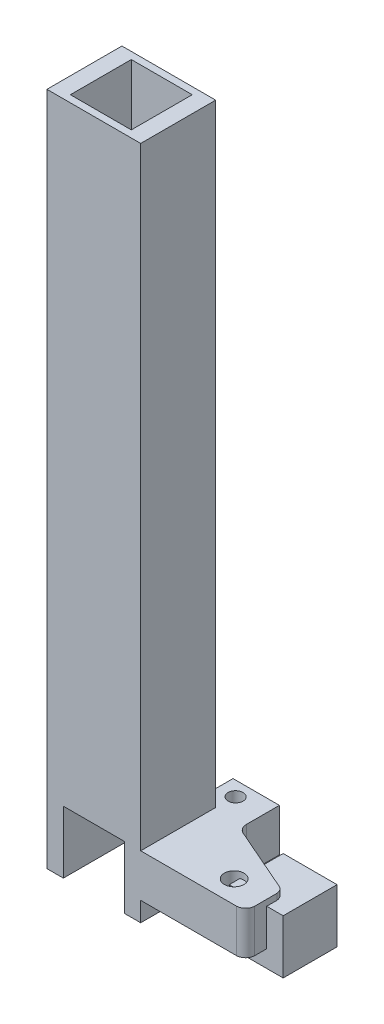
ISO-10303-21;
HEADER;
FILE_DESCRIPTION(('STEP AP214'),'2;1');
FILE_NAME('part.step','',(''),(''),'','','');
FILE_SCHEMA(('AUTOMOTIVE_DESIGN { 1 0 10303 214 1 1 1 1 }'));
ENDSEC;
DATA;
#1=APPLICATION_CONTEXT('core data for automotive mechanical design processes');
#2=APPLICATION_PROTOCOL_DEFINITION('international standard','automotive_design',2000,#1);
#3=PRODUCT_CONTEXT('',#1,'mechanical');
#4=PRODUCT('Part','Part','',(#3));
#5=PRODUCT_RELATED_PRODUCT_CATEGORY('part','',(#4));
#6=PRODUCT_DEFINITION_FORMATION('','',#4);
#7=PRODUCT_DEFINITION_CONTEXT('part definition',#1,'design');
#8=PRODUCT_DEFINITION('design','',#6,#7);
#9=PRODUCT_DEFINITION_SHAPE('','',#8);
#10=(LENGTH_UNIT() NAMED_UNIT(*) SI_UNIT(.MILLI.,.METRE.));
#11=(NAMED_UNIT(*) PLANE_ANGLE_UNIT() SI_UNIT($,.RADIAN.));
#12=(NAMED_UNIT(*) SI_UNIT($,.STERADIAN.) SOLID_ANGLE_UNIT());
#13=UNCERTAINTY_MEASURE_WITH_UNIT(LENGTH_MEASURE(1.E-05),#10,'distance_accuracy_value','');
#14=(GEOMETRIC_REPRESENTATION_CONTEXT(3) GLOBAL_UNCERTAINTY_ASSIGNED_CONTEXT((#13)) GLOBAL_UNIT_ASSIGNED_CONTEXT((#10,
#11,#12)) REPRESENTATION_CONTEXT('',''));
#15=CARTESIAN_POINT('',(0.,0.,0.));
#16=DIRECTION('',(0.,0.,1.));
#17=DIRECTION('',(1.,0.,0.));
#18=AXIS2_PLACEMENT_3D('',#15,#16,#17);
#19=CARTESIAN_POINT('',(-22.1081588772787,1.3,16.));
#20=DIRECTION('',(0.,-1.,0.));
#21=DIRECTION('',(0.,0.,-1.));
#22=AXIS2_PLACEMENT_3D('',#19,#20,#21);
#23=PLANE('',#22);
#24=CARTESIAN_POINT('',(-10.7531974056641,1.3,11.199999999995));
#25=DIRECTION('',(0.,1.,0.));
#26=DIRECTION('',(0.,0.,1.));
#27=AXIS2_PLACEMENT_3D('',#24,#25,#26);
#28=CIRCLE('',#27,2.1);
#29=CARTESIAN_POINT('',(-10.7531974056641,1.3,13.299999999995));
#30=VERTEX_POINT('',#29);
#31=EDGE_CURVE('E231',#30,#30,#28,.T.);
#32=ORIENTED_EDGE('',*,*,#31,.F.);
#33=EDGE_LOOP('',(#32));
#34=FACE_BOUND('',#33,.T.);
#35=CARTESIAN_POINT('',(-25.7531588772787,1.3,-4.1));
#36=DIRECTION('',(0.,1.,0.));
#37=DIRECTION('',(0.,0.,1.));
#38=AXIS2_PLACEMENT_3D('',#35,#36,#37);
#39=CIRCLE('',#38,1.6);
#40=CARTESIAN_POINT('',(-25.7531588772787,1.3,-2.5));
#41=VERTEX_POINT('',#40);
#42=EDGE_CURVE('E282',#41,#41,#39,.T.);
#43=ORIENTED_EDGE('',*,*,#42,.F.);
#44=EDGE_LOOP('',(#43));
#45=FACE_BOUND('',#44,.T.);
#46=CARTESIAN_POINT('',(-5.35319740566404,1.3,9.45803114956662));
#47=DIRECTION('',(0.,1.,0.));
#48=DIRECTION('',(0.,0.,1.));
#49=AXIS2_PLACEMENT_3D('',#46,#47,#48);
#50=CIRCLE('',#49,1.85);
#51=CARTESIAN_POINT('',(-3.50815887727866,1.3,9.32263237271288));
#52=VERTEX_POINT('',#51);
#53=CARTESIAN_POINT('',(-4.61168256272759,1.3,7.76314007999756));
#54=VERTEX_POINT('',#53);
#55=EDGE_CURVE('E63',#52,#54,#50,.T.);
#56=ORIENTED_EDGE('',*,*,#55,.T.);
#57=DIRECTION('',(-0.91615733490219,0.,-0.400818834019706));
#58=VECTOR('',#57,1.);
#59=CARTESIAN_POINT('',(-3.59162011322418,1.3,8.2094174016553));
#60=LINE('',#59,#58);
#61=CARTESIAN_POINT('',(-18.2149578988064,1.3,1.81170712046311));
#62=VERTEX_POINT('',#61);
#63=EDGE_CURVE('E243',#54,#62,#60,.T.);
#64=ORIENTED_EDGE('',*,*,#63,.T.);
#65=CARTESIAN_POINT('',(-17.353197405664,1.3,-0.158031149576604));
#66=DIRECTION('',(0.,1.,0.));
#67=DIRECTION('',(0.,0.,1.));
#68=AXIS2_PLACEMENT_3D('',#65,#66,#67);
#69=CIRCLE('',#68,2.15);
#70=CARTESIAN_POINT('',(-19.503197405664,1.3,-0.158031149576604));
#71=VERTEX_POINT('',#70);
#72=EDGE_CURVE('E240',#71,#62,#69,.T.);
#73=ORIENTED_EDGE('',*,*,#72,.F.);
#74=DIRECTION('',(0.,0.,-1.));
#75=VECTOR('',#74,1.);
#76=CARTESIAN_POINT('',(-19.503197405664,1.3,0.));
#77=LINE('',#76,#75);
#78=CARTESIAN_POINT('',(-19.503197405664,1.3,-7.2));
#79=VERTEX_POINT('',#78);
#80=EDGE_CURVE('E237',#71,#79,#77,.T.);
#81=ORIENTED_EDGE('',*,*,#80,.T.);
#82=DIRECTION('',(1.,0.,0.));
#83=VECTOR('',#82,1.);
#84=CARTESIAN_POINT('',(-29.3981588772787,1.3,-7.2));
#85=LINE('',#84,#83);
#86=CARTESIAN_POINT('',(-29.3981588772787,1.3,-7.2));
#87=VERTEX_POINT('',#86);
#88=EDGE_CURVE('E229',#87,#79,#85,.T.);
#89=ORIENTED_EDGE('',*,*,#88,.F.);
#90=DIRECTION('',(0.,0.,1.));
#91=VECTOR('',#90,1.);
#92=CARTESIAN_POINT('',(-29.3981588772787,1.3,-7.2));
#93=LINE('',#92,#91);
#94=CARTESIAN_POINT('',(-29.3981588772787,1.3,0.));
#95=VERTEX_POINT('',#94);
#96=EDGE_CURVE('E291',#87,#95,#93,.T.);
#97=ORIENTED_EDGE('',*,*,#96,.T.);
#98=DIRECTION('',(1.,0.,0.));
#99=VECTOR('',#98,1.);
#100=CARTESIAN_POINT('',(-29.3981588772787,1.3,0.));
#101=LINE('',#100,#99);
#102=CARTESIAN_POINT('',(-25.8981588772787,1.3,0.));
#103=VERTEX_POINT('',#102);
#104=EDGE_CURVE('E287',#95,#103,#101,.T.);
#105=ORIENTED_EDGE('',*,*,#104,.T.);
#106=DIRECTION('',(0.,0.,1.));
#107=VECTOR('',#106,1.);
#108=CARTESIAN_POINT('',(-25.8981588772787,1.3,16.));
#109=LINE('',#108,#107);
#110=CARTESIAN_POINT('',(-25.8981588772787,1.3,16.));
#111=VERTEX_POINT('',#110);
#112=EDGE_CURVE('E299',#103,#111,#109,.T.);
#113=ORIENTED_EDGE('',*,*,#112,.T.);
#114=DIRECTION('',(-1.,0.,0.));
#115=VECTOR('',#114,1.);
#116=CARTESIAN_POINT('',(-22.1081588772787,1.3,16.));
#117=LINE('',#116,#115);
#118=CARTESIAN_POINT('',(-5.50319740566405,1.3,16.));
#119=VERTEX_POINT('',#118);
#120=EDGE_CURVE('E302',#119,#111,#117,.T.);
#121=ORIENTED_EDGE('',*,*,#120,.F.);
#122=CARTESIAN_POINT('',(-5.50319740566405,1.3,13.999999999995));
#123=DIRECTION('',(0.,1.,0.));
#124=DIRECTION('',(0.,0.,1.));
#125=AXIS2_PLACEMENT_3D('',#122,#123,#124);
#126=CIRCLE('',#125,2.00000000000004);
#127=CARTESIAN_POINT('',(-3.50815887727866,1.3,14.1407880330732));
#128=VERTEX_POINT('',#127);
#129=EDGE_CURVE('E251',#119,#128,#126,.T.);
#130=ORIENTED_EDGE('',*,*,#129,.T.);
#131=DIRECTION('',(0.,0.,1.));
#132=VECTOR('',#131,1.);
#133=CARTESIAN_POINT('',(-3.50815887727866,1.3,16.));
#134=LINE('',#133,#132);
#135=EDGE_CURVE('E260',#52,#128,#134,.T.);
#136=ORIENTED_EDGE('',*,*,#135,.F.);
#137=EDGE_LOOP('',(#56,#64,#73,#81,#89,#97,#105,#113,#121,#130,#136));
#138=FACE_BOUND('',#137,.T.);
#139=ADVANCED_FACE('F47',(#34,#45,#138),#23,.F.);
#140=CARTESIAN_POINT('',(-22.1081588772787,-7.85,0.));
#141=DIRECTION('',(0.,1.,0.));
#142=DIRECTION('',(0.,0.,1.));
#143=AXIS2_PLACEMENT_3D('',#140,#141,#142);
#144=PLANE('',#143);
#145=CARTESIAN_POINT('',(-10.7531974056641,-7.85,11.199999999995));
#146=DIRECTION('',(0.,1.,0.));
#147=DIRECTION('',(0.,0.,1.));
#148=AXIS2_PLACEMENT_3D('',#145,#146,#147);
#149=CIRCLE('',#148,2.1);
#150=CARTESIAN_POINT('',(-10.7531974056641,-7.85,13.299999999995));
#151=VERTEX_POINT('',#150);
#152=EDGE_CURVE('E51',#151,#151,#149,.T.);
#153=ORIENTED_EDGE('',*,*,#152,.T.);
#154=EDGE_LOOP('',(#153));
#155=FACE_BOUND('',#154,.T.);
#156=CARTESIAN_POINT('',(-25.7531588772787,-7.85,-4.1));
#157=DIRECTION('',(0.,1.,0.));
#158=DIRECTION('',(0.,0.,1.));
#159=AXIS2_PLACEMENT_3D('',#156,#157,#158);
#160=CIRCLE('',#159,1.6);
#161=CARTESIAN_POINT('',(-25.7531588772787,-7.85,-2.5));
#162=VERTEX_POINT('',#161);
#163=EDGE_CURVE('E263',#162,#162,#160,.F.);
#164=ORIENTED_EDGE('',*,*,#163,.F.);
#165=EDGE_LOOP('',(#164));
#166=FACE_BOUND('',#165,.T.);
#167=CARTESIAN_POINT('',(-5.35319740566404,-7.85,9.45803114956662));
#168=DIRECTION('',(0.,1.,0.));
#169=DIRECTION('',(0.,0.,1.));
#170=AXIS2_PLACEMENT_3D('',#167,#168,#169);
#171=CIRCLE('',#170,1.85);
#172=CARTESIAN_POINT('',(-3.50815887727866,-7.85,9.32263237271287));
#173=VERTEX_POINT('',#172);
#174=CARTESIAN_POINT('',(-4.61168256272759,-7.85,7.76314007999756));
#175=VERTEX_POINT('',#174);
#176=EDGE_CURVE('E225',#173,#175,#171,.T.);
#177=ORIENTED_EDGE('',*,*,#176,.F.);
#178=DIRECTION('',(0.,0.,-1.));
#179=VECTOR('',#178,1.);
#180=CARTESIAN_POINT('',(-3.50815887727866,-7.85,16.));
#181=LINE('',#180,#179);
#182=CARTESIAN_POINT('',(-3.50815887727866,-7.85,14.1407880330732));
#183=VERTEX_POINT('',#182);
#184=EDGE_CURVE('E224',#183,#173,#181,.T.);
#185=ORIENTED_EDGE('',*,*,#184,.F.);
#186=CARTESIAN_POINT('',(-5.50319740566405,-7.85,13.999999999995));
#187=DIRECTION('',(0.,1.,0.));
#188=DIRECTION('',(0.,0.,1.));
#189=AXIS2_PLACEMENT_3D('',#186,#187,#188);
#190=CIRCLE('',#189,2.00000000000004);
#191=CARTESIAN_POINT('',(-5.50319740566405,-7.85,16.));
#192=VERTEX_POINT('',#191);
#193=EDGE_CURVE('E71',#192,#183,#190,.T.);
#194=ORIENTED_EDGE('',*,*,#193,.F.);
#195=DIRECTION('',(-1.,0.,0.));
#196=VECTOR('',#195,1.);
#197=CARTESIAN_POINT('',(-22.1081588772787,-7.85,16.));
#198=LINE('',#197,#196);
#199=CARTESIAN_POINT('',(-25.8981588772787,-7.85,16.));
#200=VERTEX_POINT('',#199);
#201=EDGE_CURVE('E272',#192,#200,#198,.T.);
#202=ORIENTED_EDGE('',*,*,#201,.T.);
#203=DIRECTION('',(0.,0.,1.));
#204=VECTOR('',#203,1.);
#205=CARTESIAN_POINT('',(-25.8981588772787,-7.85,0.));
#206=LINE('',#205,#204);
#207=CARTESIAN_POINT('',(-25.8981588772787,-7.85,0.));
#208=VERTEX_POINT('',#207);
#209=EDGE_CURVE('E275',#208,#200,#206,.T.);
#210=ORIENTED_EDGE('',*,*,#209,.F.);
#211=DIRECTION('',(1.,0.,0.));
#212=VECTOR('',#211,1.);
#213=CARTESIAN_POINT('',(-38.1081588772787,-7.85,0.));
#214=LINE('',#213,#212);
#215=CARTESIAN_POINT('',(-29.3981588772787,-7.85,0.));
#216=VERTEX_POINT('',#215);
#217=EDGE_CURVE('E214',#216,#208,#214,.T.);
#218=ORIENTED_EDGE('',*,*,#217,.F.);
#219=DIRECTION('',(0.,0.,-1.));
#220=VECTOR('',#219,1.);
#221=CARTESIAN_POINT('',(-29.3981588772787,-7.85,1.5));
#222=LINE('',#221,#220);
#223=CARTESIAN_POINT('',(-29.3981588772787,-7.85,-7.2));
#224=VERTEX_POINT('',#223);
#225=EDGE_CURVE('E210',#216,#224,#222,.T.);
#226=ORIENTED_EDGE('',*,*,#225,.T.);
#227=DIRECTION('',(1.,0.,0.));
#228=VECTOR('',#227,1.);
#229=CARTESIAN_POINT('',(-38.1081588772787,-7.85,-7.2));
#230=LINE('',#229,#228);
#231=CARTESIAN_POINT('',(-19.503197405664,-7.85,-7.2));
#232=VERTEX_POINT('',#231);
#233=EDGE_CURVE('E202',#224,#232,#230,.T.);
#234=ORIENTED_EDGE('',*,*,#233,.T.);
#235=DIRECTION('',(0.,0.,-1.));
#236=VECTOR('',#235,1.);
#237=CARTESIAN_POINT('',(-19.503197405664,-7.85,0.));
#238=LINE('',#237,#236);
#239=CARTESIAN_POINT('',(-19.503197405664,-7.85,-0.158031149576604));
#240=VERTEX_POINT('',#239);
#241=EDGE_CURVE('E207',#240,#232,#238,.T.);
#242=ORIENTED_EDGE('',*,*,#241,.F.);
#243=CARTESIAN_POINT('',(-17.353197405664,-7.85,-0.158031149576604));
#244=DIRECTION('',(0.,1.,0.));
#245=DIRECTION('',(0.,0.,1.));
#246=AXIS2_PLACEMENT_3D('',#243,#244,#245);
#247=CIRCLE('',#246,2.15);
#248=CARTESIAN_POINT('',(-18.2149578988064,-7.85,1.81170712046311));
#249=VERTEX_POINT('',#248);
#250=EDGE_CURVE('E56',#240,#249,#247,.T.);
#251=ORIENTED_EDGE('',*,*,#250,.T.);
#252=DIRECTION('',(-0.91615733490219,0.,-0.400818834019706));
#253=VECTOR('',#252,1.);
#254=CARTESIAN_POINT('',(-22.1479764167761,-7.85,0.0910115188513615));
#255=LINE('',#254,#253);
#256=EDGE_CURVE('E12',#175,#249,#255,.T.);
#257=ORIENTED_EDGE('',*,*,#256,.F.);
#258=EDGE_LOOP('',(#177,#185,#194,#202,#210,#218,#226,#234,#242,#251,#257));
#259=FACE_BOUND('',#258,.T.);
#260=ADVANCED_FACE('F205',(#155,#166,#259),#144,.F.);
#261=CARTESIAN_POINT('',(-3.50815887727866,0.,0.));
#262=DIRECTION('',(1.,0.,0.));
#263=DIRECTION('',(0.,0.,-1.));
#264=AXIS2_PLACEMENT_3D('',#261,#262,#263);
#265=PLANE('',#264);
#266=ORIENTED_EDGE('',*,*,#184,.T.);
#267=DIRECTION('',(0.,1.,0.));
#268=VECTOR('',#267,1.);
#269=CARTESIAN_POINT('',(-3.50815887727866,-17.3,9.32263237271287));
#270=LINE('',#269,#268);
#271=EDGE_CURVE('E388',#173,#52,#270,.T.);
#272=ORIENTED_EDGE('',*,*,#271,.T.);
#273=ORIENTED_EDGE('',*,*,#135,.T.);
#274=DIRECTION('',(0.,1.,0.));
#275=VECTOR('',#274,1.);
#276=CARTESIAN_POINT('',(-3.50815887727866,-17.3,14.1407880330732));
#277=LINE('',#276,#275);
#278=EDGE_CURVE('E294',#128,#183,#277,.F.);
#279=ORIENTED_EDGE('',*,*,#278,.T.);
#280=EDGE_LOOP('',(#266,#272,#273,#279));
#281=FACE_BOUND('',#280,.T.);
#282=ADVANCED_FACE('F402',(#281),#265,.T.);
#283=CARTESIAN_POINT('',(-25.8981588772787,-12.,16.));
#284=DIRECTION('',(-1.,0.,0.));
#285=DIRECTION('',(0.,0.,1.));
#286=AXIS2_PLACEMENT_3D('',#283,#284,#285);
#287=PLANE('',#286);
#288=ORIENTED_EDGE('',*,*,#112,.F.);
#289=DIRECTION('',(0.,1.,0.));
#290=VECTOR('',#289,1.);
#291=CARTESIAN_POINT('',(-25.8981588772787,-12.,0.));
#292=LINE('',#291,#290);
#293=CARTESIAN_POINT('',(-25.8981588772787,132.,0.));
#294=VERTEX_POINT('',#293);
#295=EDGE_CURVE('E377',#103,#294,#292,.T.);
#296=ORIENTED_EDGE('',*,*,#295,.T.);
#297=DIRECTION('',(0.,0.,-1.));
#298=VECTOR('',#297,1.);
#299=CARTESIAN_POINT('',(-25.8981588772787,132.,16.));
#300=LINE('',#299,#298);
#301=CARTESIAN_POINT('',(-25.8981588772787,132.,16.));
#302=VERTEX_POINT('',#301);
#303=EDGE_CURVE('E382',#302,#294,#300,.T.);
#304=ORIENTED_EDGE('',*,*,#303,.F.);
#305=DIRECTION('',(0.,1.,0.));
#306=VECTOR('',#305,1.);
#307=CARTESIAN_POINT('',(-25.8981588772787,-12.,16.));
#308=LINE('',#307,#306);
#309=EDGE_CURVE('E367',#111,#302,#308,.T.);
#310=ORIENTED_EDGE('',*,*,#309,.F.);
#311=EDGE_LOOP('',(#288,#296,#304,#310));
#312=FACE_BOUND('',#311,.T.);
#313=ADVANCED_FACE('F414',(#312),#287,.F.);
#314=CARTESIAN_POINT('',(-45.8981588772787,-12.,16.));
#315=DIRECTION('',(0.,1.,0.));
#316=DIRECTION('',(0.,0.,1.));
#317=AXIS2_PLACEMENT_3D('',#314,#315,#316);
#318=PLANE('',#317);
#319=DIRECTION('',(1.,0.,0.));
#320=VECTOR('',#319,1.);
#321=CARTESIAN_POINT('',(-45.8981588772787,-12.,0.));
#322=LINE('',#321,#320);
#323=CARTESIAN_POINT('',(-45.8981588772787,-12.,0.));
#324=VERTEX_POINT('',#323);
#325=CARTESIAN_POINT('',(-42.3981588772787,-12.,0.));
#326=VERTEX_POINT('',#325);
#327=EDGE_CURVE('E374',#324,#326,#322,.T.);
#328=ORIENTED_EDGE('',*,*,#327,.T.);
#329=DIRECTION('',(0.,0.,1.));
#330=VECTOR('',#329,1.);
#331=CARTESIAN_POINT('',(-42.3981588772787,-12.,1.5));
#332=LINE('',#331,#330);
#333=CARTESIAN_POINT('',(-42.3981588772787,-12.,16.));
#334=VERTEX_POINT('',#333);
#335=EDGE_CURVE('E337',#326,#334,#332,.T.);
#336=ORIENTED_EDGE('',*,*,#335,.T.);
#337=DIRECTION('',(1.,0.,0.));
#338=VECTOR('',#337,1.);
#339=CARTESIAN_POINT('',(-45.8981588772787,-12.,16.));
#340=LINE('',#339,#338);
#341=CARTESIAN_POINT('',(-45.8981588772787,-12.,16.));
#342=VERTEX_POINT('',#341);
#343=EDGE_CURVE('E364',#342,#334,#340,.T.);
#344=ORIENTED_EDGE('',*,*,#343,.F.);
#345=DIRECTION('',(0.,0.,-1.));
#346=VECTOR('',#345,1.);
#347=CARTESIAN_POINT('',(-45.8981588772787,-12.,16.));
#348=LINE('',#347,#346);
#349=EDGE_CURVE('E295',#342,#324,#348,.T.);
#350=ORIENTED_EDGE('',*,*,#349,.T.);
#351=EDGE_LOOP('',(#328,#336,#344,#350));
#352=FACE_BOUND('',#351,.T.);
#353=ADVANCED_FACE('F427',(#352),#318,.F.);
#354=CARTESIAN_POINT('',(-45.8981588772787,-12.,16.));
#355=DIRECTION('',(1.,0.,0.));
#356=DIRECTION('',(0.,0.,-1.));
#357=AXIS2_PLACEMENT_3D('',#354,#355,#356);
#358=PLANE('',#357);
#359=DIRECTION('',(0.,-1.,0.));
#360=VECTOR('',#359,1.);
#361=CARTESIAN_POINT('',(-45.8981588772787,-12.,0.));
#362=LINE('',#361,#360);
#363=CARTESIAN_POINT('',(-45.8981588772787,132.,0.));
#364=VERTEX_POINT('',#363);
#365=EDGE_CURVE('E353',#364,#324,#362,.T.);
#366=ORIENTED_EDGE('',*,*,#365,.T.);
#367=ORIENTED_EDGE('',*,*,#349,.F.);
#368=DIRECTION('',(0.,-1.,0.));
#369=VECTOR('',#368,1.);
#370=CARTESIAN_POINT('',(-45.8981588772787,-12.,16.));
#371=LINE('',#370,#369);
#372=CARTESIAN_POINT('',(-45.8981588772787,132.,16.));
#373=VERTEX_POINT('',#372);
#374=EDGE_CURVE('E359',#373,#342,#371,.T.);
#375=ORIENTED_EDGE('',*,*,#374,.F.);
#376=DIRECTION('',(0.,0.,-1.));
#377=VECTOR('',#376,1.);
#378=CARTESIAN_POINT('',(-45.8981588772787,132.,16.));
#379=LINE('',#378,#377);
#380=EDGE_CURVE('E371',#373,#364,#379,.T.);
#381=ORIENTED_EDGE('',*,*,#380,.T.);
#382=EDGE_LOOP('',(#366,#367,#375,#381));
#383=FACE_BOUND('',#382,.T.);
#384=ADVANCED_FACE('F49',(#383),#358,.F.);
#385=DIRECTION('',(0.,0.,1.));
#386=VECTOR('',#385,1.);
#387=CARTESIAN_POINT('',(-29.3981588772787,-12.,1.5));
#388=LINE('',#387,#386);
#389=CARTESIAN_POINT('',(-29.3981588772787,-12.,0.));
#390=VERTEX_POINT('',#389);
#391=CARTESIAN_POINT('',(-29.3981588772787,-12.,16.));
#392=VERTEX_POINT('',#391);
#393=EDGE_CURVE('E335',#390,#392,#388,.T.);
#394=ORIENTED_EDGE('',*,*,#393,.F.);
#395=DIRECTION('',(1.,0.,0.));
#396=VECTOR('',#395,1.);
#397=CARTESIAN_POINT('',(-38.1081588772787,-12.,0.));
#398=LINE('',#397,#396);
#399=CARTESIAN_POINT('',(-25.8981588772787,-12.,0.));
#400=VERTEX_POINT('',#399);
#401=EDGE_CURVE('E215',#390,#400,#398,.T.);
#402=ORIENTED_EDGE('',*,*,#401,.T.);
#403=DIRECTION('',(0.,0.,1.));
#404=VECTOR('',#403,1.);
#405=CARTESIAN_POINT('',(-25.8981588772787,-12.,0.));
#406=LINE('',#405,#404);
#407=CARTESIAN_POINT('',(-25.8981588772787,-12.,16.));
#408=VERTEX_POINT('',#407);
#409=EDGE_CURVE('E279',#400,#408,#406,.T.);
#410=ORIENTED_EDGE('',*,*,#409,.T.);
#411=EDGE_CURVE('E362',#392,#408,#340,.T.);
#412=ORIENTED_EDGE('',*,*,#411,.F.);
#413=EDGE_LOOP('',(#394,#402,#410,#412));
#414=FACE_BOUND('',#413,.T.);
#415=ADVANCED_FACE('F445',(#414),#318,.F.);
#416=CARTESIAN_POINT('',(-45.8981588772787,132.,16.));
#417=DIRECTION('',(0.,-1.,0.));
#418=DIRECTION('',(0.,0.,-1.));
#419=AXIS2_PLACEMENT_3D('',#416,#417,#418);
#420=PLANE('',#419);
#421=DIRECTION('',(0.,0.,1.));
#422=VECTOR('',#421,1.);
#423=CARTESIAN_POINT('',(-29.3981588772787,132.,1.5));
#424=LINE('',#423,#422);
#425=CARTESIAN_POINT('',(-29.3981588772787,132.,1.5));
#426=VERTEX_POINT('',#425);
#427=CARTESIAN_POINT('',(-29.3981588772787,132.,14.5));
#428=VERTEX_POINT('',#427);
#429=EDGE_CURVE('E343',#426,#428,#424,.T.);
#430=ORIENTED_EDGE('',*,*,#429,.T.);
#431=DIRECTION('',(1.,0.,0.));
#432=VECTOR('',#431,1.);
#433=CARTESIAN_POINT('',(-42.3981588772787,132.,14.5));
#434=LINE('',#433,#432);
#435=CARTESIAN_POINT('',(-42.3981588772787,132.,14.5));
#436=VERTEX_POINT('',#435);
#437=EDGE_CURVE('E334',#436,#428,#434,.T.);
#438=ORIENTED_EDGE('',*,*,#437,.F.);
#439=DIRECTION('',(0.,0.,1.));
#440=VECTOR('',#439,1.);
#441=CARTESIAN_POINT('',(-42.3981588772787,132.,1.5));
#442=LINE('',#441,#440);
#443=CARTESIAN_POINT('',(-42.3981588772787,132.,1.5));
#444=VERTEX_POINT('',#443);
#445=EDGE_CURVE('E338',#444,#436,#442,.T.);
#446=ORIENTED_EDGE('',*,*,#445,.F.);
#447=DIRECTION('',(1.,0.,0.));
#448=VECTOR('',#447,1.);
#449=CARTESIAN_POINT('',(-42.3981588772787,132.,1.5));
#450=LINE('',#449,#448);
#451=EDGE_CURVE('E346',#444,#426,#450,.T.);
#452=ORIENTED_EDGE('',*,*,#451,.T.);
#453=EDGE_LOOP('',(#430,#438,#446,#452));
#454=FACE_BOUND('',#453,.T.);
#455=DIRECTION('',(-1.,0.,0.));
#456=VECTOR('',#455,1.);
#457=CARTESIAN_POINT('',(-45.8981588772787,132.,0.));
#458=LINE('',#457,#456);
#459=EDGE_CURVE('E363',#294,#364,#458,.T.);
#460=ORIENTED_EDGE('',*,*,#459,.T.);
#461=ORIENTED_EDGE('',*,*,#380,.F.);
#462=DIRECTION('',(-1.,0.,0.));
#463=VECTOR('',#462,1.);
#464=CARTESIAN_POINT('',(-45.8981588772787,132.,16.));
#465=LINE('',#464,#463);
#466=EDGE_CURVE('E369',#302,#373,#465,.T.);
#467=ORIENTED_EDGE('',*,*,#466,.F.);
#468=ORIENTED_EDGE('',*,*,#303,.T.);
#469=EDGE_LOOP('',(#460,#461,#467,#468));
#470=FACE_BOUND('',#469,.T.);
#471=ADVANCED_FACE('F420',(#454,#470),#420,.F.);
#472=CARTESIAN_POINT('',(0.,0.,16.));
#473=DIRECTION('',(0.,0.,-1.));
#474=DIRECTION('',(-1.,0.,0.));
#475=AXIS2_PLACEMENT_3D('',#472,#473,#474);
#476=PLANE('',#475);
#477=ORIENTED_EDGE('',*,*,#201,.F.);
#478=DIRECTION('',(0.,1.,0.));
#479=VECTOR('',#478,1.);
#480=CARTESIAN_POINT('',(-5.50319740566405,-17.3,16.));
#481=LINE('',#480,#479);
#482=EDGE_CURVE('E238',#192,#119,#481,.T.);
#483=ORIENTED_EDGE('',*,*,#482,.T.);
#484=ORIENTED_EDGE('',*,*,#120,.T.);
#485=ORIENTED_EDGE('',*,*,#309,.T.);
#486=ORIENTED_EDGE('',*,*,#466,.T.);
#487=ORIENTED_EDGE('',*,*,#374,.T.);
#488=ORIENTED_EDGE('',*,*,#343,.T.);
#489=DIRECTION('',(0.,-1.,0.));
#490=VECTOR('',#489,1.);
#491=CARTESIAN_POINT('',(-42.3981588772787,1.3,16.));
#492=LINE('',#491,#490);
#493=CARTESIAN_POINT('',(-42.3981588772787,1.3,16.));
#494=VERTEX_POINT('',#493);
#495=EDGE_CURVE('E318',#494,#334,#492,.T.);
#496=ORIENTED_EDGE('',*,*,#495,.F.);
#497=DIRECTION('',(-1.,0.,0.));
#498=VECTOR('',#497,1.);
#499=CARTESIAN_POINT('',(-29.3981588772787,1.3,16.));
#500=LINE('',#499,#498);
#501=CARTESIAN_POINT('',(-29.3981588772787,1.3,16.));
#502=VERTEX_POINT('',#501);
#503=EDGE_CURVE('E326',#502,#494,#500,.T.);
#504=ORIENTED_EDGE('',*,*,#503,.F.);
#505=DIRECTION('',(0.,-1.,0.));
#506=VECTOR('',#505,1.);
#507=CARTESIAN_POINT('',(-29.3981588772787,1.3,16.));
#508=LINE('',#507,#506);
#509=EDGE_CURVE('E323',#502,#392,#508,.T.);
#510=ORIENTED_EDGE('',*,*,#509,.T.);
#511=ORIENTED_EDGE('',*,*,#411,.T.);
#512=DIRECTION('',(0.,-1.,0.));
#513=VECTOR('',#512,1.);
#514=CARTESIAN_POINT('',(-25.8981588772787,-12.,16.));
#515=LINE('',#514,#513);
#516=EDGE_CURVE('E276',#200,#408,#515,.T.);
#517=ORIENTED_EDGE('',*,*,#516,.F.);
#518=EDGE_LOOP('',(#477,#483,#484,#485,#486,#487,#488,#496,#504,#510,#511,#517));
#519=FACE_BOUND('',#518,.T.);
#520=ADVANCED_FACE('F411',(#519),#476,.F.);
#521=CARTESIAN_POINT('',(0.,0.,0.));
#522=DIRECTION('',(0.,0.,-1.));
#523=DIRECTION('',(-1.,0.,0.));
#524=AXIS2_PLACEMENT_3D('',#521,#522,#523);
#525=PLANE('',#524);
#526=DIRECTION('',(0.,1.,0.));
#527=VECTOR('',#526,1.);
#528=CARTESIAN_POINT('',(-29.3981588772787,-12.,0.));
#529=LINE('',#528,#527);
#530=CARTESIAN_POINT('',(-29.3981588772787,-4.,0.));
#531=VERTEX_POINT('',#530);
#532=EDGE_CURVE('E292',#531,#95,#529,.T.);
#533=ORIENTED_EDGE('',*,*,#532,.F.);
#534=DIRECTION('',(1.,0.,0.));
#535=VECTOR('',#534,1.);
#536=CARTESIAN_POINT('',(-42.3981588772787,-4.,0.));
#537=LINE('',#536,#535);
#538=CARTESIAN_POINT('',(-42.3981588772787,-4.,0.));
#539=VERTEX_POINT('',#538);
#540=EDGE_CURVE('E304',#539,#531,#537,.T.);
#541=ORIENTED_EDGE('',*,*,#540,.F.);
#542=DIRECTION('',(0.,-1.,0.));
#543=VECTOR('',#542,1.);
#544=CARTESIAN_POINT('',(-42.3981588772787,-4.,0.));
#545=LINE('',#544,#543);
#546=EDGE_CURVE('E309',#539,#326,#545,.T.);
#547=ORIENTED_EDGE('',*,*,#546,.T.);
#548=ORIENTED_EDGE('',*,*,#327,.F.);
#549=ORIENTED_EDGE('',*,*,#365,.F.);
#550=ORIENTED_EDGE('',*,*,#459,.F.);
#551=ORIENTED_EDGE('',*,*,#295,.F.);
#552=ORIENTED_EDGE('',*,*,#104,.F.);
#553=EDGE_LOOP('',(#533,#541,#547,#548,#549,#550,#551,#552));
#554=FACE_BOUND('',#553,.T.);
#555=ADVANCED_FACE('F456',(#554),#525,.T.);
#556=CARTESIAN_POINT('',(-42.3981588772787,-12.,14.5));
#557=DIRECTION('',(0.,0.,1.));
#558=DIRECTION('',(1.,0.,0.));
#559=AXIS2_PLACEMENT_3D('',#556,#557,#558);
#560=PLANE('',#559);
#561=DIRECTION('',(0.,1.,0.));
#562=VECTOR('',#561,1.);
#563=CARTESIAN_POINT('',(-29.3981588772787,-12.,14.5));
#564=LINE('',#563,#562);
#565=CARTESIAN_POINT('',(-29.3981588772787,1.3,14.5));
#566=VERTEX_POINT('',#565);
#567=EDGE_CURVE('E340',#566,#428,#564,.T.);
#568=ORIENTED_EDGE('',*,*,#567,.F.);
#569=DIRECTION('',(-1.,0.,0.));
#570=VECTOR('',#569,1.);
#571=CARTESIAN_POINT('',(-29.3981588772787,1.3,14.5));
#572=LINE('',#571,#570);
#573=CARTESIAN_POINT('',(-42.3981588772787,1.3,14.5));
#574=VERTEX_POINT('',#573);
#575=EDGE_CURVE('E319',#566,#574,#572,.T.);
#576=ORIENTED_EDGE('',*,*,#575,.T.);
#577=DIRECTION('',(0.,1.,0.));
#578=VECTOR('',#577,1.);
#579=CARTESIAN_POINT('',(-42.3981588772787,-12.,14.5));
#580=LINE('',#579,#578);
#581=EDGE_CURVE('E351',#574,#436,#580,.T.);
#582=ORIENTED_EDGE('',*,*,#581,.T.);
#583=ORIENTED_EDGE('',*,*,#437,.T.);
#584=EDGE_LOOP('',(#568,#576,#582,#583));
#585=FACE_BOUND('',#584,.T.);
#586=ADVANCED_FACE('F471',(#585),#560,.F.);
#587=CARTESIAN_POINT('',(-42.3981588772787,-12.,1.5));
#588=DIRECTION('',(-1.,0.,0.));
#589=DIRECTION('',(0.,0.,1.));
#590=AXIS2_PLACEMENT_3D('',#587,#588,#589);
#591=PLANE('',#590);
#592=ORIENTED_EDGE('',*,*,#445,.T.);
#593=ORIENTED_EDGE('',*,*,#581,.F.);
#594=DIRECTION('',(0.,0.,1.));
#595=VECTOR('',#594,1.);
#596=CARTESIAN_POINT('',(-42.3981588772787,1.3,14.5));
#597=LINE('',#596,#595);
#598=EDGE_CURVE('E332',#574,#494,#597,.T.);
#599=ORIENTED_EDGE('',*,*,#598,.T.);
#600=ORIENTED_EDGE('',*,*,#495,.T.);
#601=ORIENTED_EDGE('',*,*,#335,.F.);
#602=ORIENTED_EDGE('',*,*,#546,.F.);
#603=DIRECTION('',(0.,0.,-1.));
#604=VECTOR('',#603,1.);
#605=CARTESIAN_POINT('',(-42.3981588772787,-4.,1.5));
#606=LINE('',#605,#604);
#607=CARTESIAN_POINT('',(-42.3981588772787,-4.,1.5));
#608=VERTEX_POINT('',#607);
#609=EDGE_CURVE('E308',#608,#539,#606,.T.);
#610=ORIENTED_EDGE('',*,*,#609,.F.);
#611=DIRECTION('',(0.,1.,0.));
#612=VECTOR('',#611,1.);
#613=CARTESIAN_POINT('',(-42.3981588772787,-12.,1.5));
#614=LINE('',#613,#612);
#615=EDGE_CURVE('E354',#608,#444,#614,.T.);
#616=ORIENTED_EDGE('',*,*,#615,.T.);
#617=EDGE_LOOP('',(#592,#593,#599,#600,#601,#602,#610,#616));
#618=FACE_BOUND('',#617,.T.);
#619=ADVANCED_FACE('F430',(#618),#591,.F.);
#620=CARTESIAN_POINT('',(-42.3981588772787,-12.,1.5));
#621=DIRECTION('',(0.,0.,1.));
#622=DIRECTION('',(1.,0.,0.));
#623=AXIS2_PLACEMENT_3D('',#620,#621,#622);
#624=PLANE('',#623);
#625=DIRECTION('',(1.,0.,0.));
#626=VECTOR('',#625,1.);
#627=CARTESIAN_POINT('',(-42.3981588772787,-4.,1.5));
#628=LINE('',#627,#626);
#629=CARTESIAN_POINT('',(-29.3981588772787,-4.,1.5));
#630=VERTEX_POINT('',#629);
#631=EDGE_CURVE('E305',#608,#630,#628,.T.);
#632=ORIENTED_EDGE('',*,*,#631,.T.);
#633=DIRECTION('',(0.,1.,0.));
#634=VECTOR('',#633,1.);
#635=CARTESIAN_POINT('',(-29.3981588772787,-12.,1.5));
#636=LINE('',#635,#634);
#637=EDGE_CURVE('E356',#630,#426,#636,.T.);
#638=ORIENTED_EDGE('',*,*,#637,.T.);
#639=ORIENTED_EDGE('',*,*,#451,.F.);
#640=ORIENTED_EDGE('',*,*,#615,.F.);
#641=EDGE_LOOP('',(#632,#638,#639,#640));
#642=FACE_BOUND('',#641,.T.);
#643=ADVANCED_FACE('F465',(#642),#624,.T.);
#644=CARTESIAN_POINT('',(-29.3981588772787,-12.,1.5));
#645=DIRECTION('',(-1.,0.,0.));
#646=DIRECTION('',(0.,0.,1.));
#647=AXIS2_PLACEMENT_3D('',#644,#645,#646);
#648=PLANE('',#647);
#649=DIRECTION('',(0.,1.,0.));
#650=VECTOR('',#649,1.);
#651=CARTESIAN_POINT('',(-29.3981588772787,-12.,0.));
#652=LINE('',#651,#650);
#653=EDGE_CURVE('E270',#390,#216,#652,.T.);
#654=ORIENTED_EDGE('',*,*,#653,.F.);
#655=ORIENTED_EDGE('',*,*,#393,.T.);
#656=ORIENTED_EDGE('',*,*,#509,.F.);
#657=DIRECTION('',(0.,0.,1.));
#658=VECTOR('',#657,1.);
#659=CARTESIAN_POINT('',(-29.3981588772787,1.3,14.5));
#660=LINE('',#659,#658);
#661=EDGE_CURVE('E322',#566,#502,#660,.T.);
#662=ORIENTED_EDGE('',*,*,#661,.F.);
#663=ORIENTED_EDGE('',*,*,#567,.T.);
#664=ORIENTED_EDGE('',*,*,#429,.F.);
#665=ORIENTED_EDGE('',*,*,#637,.F.);
#666=DIRECTION('',(0.,0.,-1.));
#667=VECTOR('',#666,1.);
#668=CARTESIAN_POINT('',(-29.3981588772787,-4.,1.5));
#669=LINE('',#668,#667);
#670=EDGE_CURVE('E315',#630,#531,#669,.T.);
#671=ORIENTED_EDGE('',*,*,#670,.T.);
#672=ORIENTED_EDGE('',*,*,#532,.T.);
#673=ORIENTED_EDGE('',*,*,#96,.F.);
#674=DIRECTION('',(0.,1.,0.));
#675=VECTOR('',#674,1.);
#676=CARTESIAN_POINT('',(-29.3981588772787,-12.,-7.2));
#677=LINE('',#676,#675);
#678=EDGE_CURVE('E288',#224,#87,#677,.T.);
#679=ORIENTED_EDGE('',*,*,#678,.F.);
#680=ORIENTED_EDGE('',*,*,#225,.F.);
#681=EDGE_LOOP('',(#654,#655,#656,#662,#663,#664,#665,#671,#672,#673,#679,#680));
#682=FACE_BOUND('',#681,.T.);
#683=ADVANCED_FACE('F442',(#682),#648,.T.);
#684=CARTESIAN_POINT('',(-29.3981588772787,1.3,14.5));
#685=DIRECTION('',(0.,1.,0.));
#686=DIRECTION('',(-1.,0.,0.));
#687=AXIS2_PLACEMENT_3D('',#684,#685,#686);
#688=PLANE('',#687);
#689=ORIENTED_EDGE('',*,*,#503,.T.);
#690=ORIENTED_EDGE('',*,*,#598,.F.);
#691=ORIENTED_EDGE('',*,*,#575,.F.);
#692=ORIENTED_EDGE('',*,*,#661,.T.);
#693=EDGE_LOOP('',(#689,#690,#691,#692));
#694=FACE_BOUND('',#693,.T.);
#695=ADVANCED_FACE('F437',(#694),#688,.F.);
#696=CARTESIAN_POINT('',(-42.3981588772787,-4.,1.5));
#697=DIRECTION('',(0.,1.,0.));
#698=DIRECTION('',(-1.,0.,0.));
#699=AXIS2_PLACEMENT_3D('',#696,#697,#698);
#700=PLANE('',#699);
#701=ORIENTED_EDGE('',*,*,#540,.T.);
#702=ORIENTED_EDGE('',*,*,#670,.F.);
#703=ORIENTED_EDGE('',*,*,#631,.F.);
#704=ORIENTED_EDGE('',*,*,#609,.T.);
#705=EDGE_LOOP('',(#701,#702,#703,#704));
#706=FACE_BOUND('',#705,.T.);
#707=ADVANCED_FACE('F462',(#706),#700,.F.);
#708=CARTESIAN_POINT('',(0.,0.,-7.2));
#709=DIRECTION('',(0.,0.,-1.));
#710=DIRECTION('',(-1.,0.,0.));
#711=AXIS2_PLACEMENT_3D('',#708,#709,#710);
#712=PLANE('',#711);
#713=ORIENTED_EDGE('',*,*,#233,.F.);
#714=ORIENTED_EDGE('',*,*,#678,.T.);
#715=ORIENTED_EDGE('',*,*,#88,.T.);
#716=DIRECTION('',(0.,-1.,0.));
#717=VECTOR('',#716,1.);
#718=CARTESIAN_POINT('',(-19.503197405664,-7.85,-7.2));
#719=LINE('',#718,#717);
#720=EDGE_CURVE('E222',#79,#232,#719,.T.);
#721=ORIENTED_EDGE('',*,*,#720,.T.);
#722=EDGE_LOOP('',(#713,#714,#715,#721));
#723=FACE_BOUND('',#722,.T.);
#724=ADVANCED_FACE('F227',(#723),#712,.T.);
#725=CARTESIAN_POINT('',(-25.7531588772787,-16.5254833995939,-4.1));
#726=DIRECTION('',(0.,1.,0.));
#727=DIRECTION('',(0.,0.,1.));
#728=AXIS2_PLACEMENT_3D('',#725,#726,#727);
#729=CYLINDRICAL_SURFACE('',#728,1.6);
#730=ORIENTED_EDGE('',*,*,#163,.T.);
#731=EDGE_LOOP('',(#730));
#732=FACE_BOUND('',#731,.T.);
#733=ORIENTED_EDGE('',*,*,#42,.T.);
#734=EDGE_LOOP('',(#733));
#735=FACE_BOUND('',#734,.T.);
#736=ADVANCED_FACE('F523',(#732,#735),#729,.F.);
#737=CARTESIAN_POINT('',(-25.8981588772787,-12.,0.));
#738=DIRECTION('',(-1.,0.,0.));
#739=DIRECTION('',(0.,0.,1.));
#740=AXIS2_PLACEMENT_3D('',#737,#738,#739);
#741=PLANE('',#740);
#742=ORIENTED_EDGE('',*,*,#516,.T.);
#743=ORIENTED_EDGE('',*,*,#409,.F.);
#744=DIRECTION('',(0.,-1.,0.));
#745=VECTOR('',#744,1.);
#746=CARTESIAN_POINT('',(-25.8981588772787,-12.,0.));
#747=LINE('',#746,#745);
#748=EDGE_CURVE('E273',#208,#400,#747,.T.);
#749=ORIENTED_EDGE('',*,*,#748,.F.);
#750=ORIENTED_EDGE('',*,*,#209,.T.);
#751=EDGE_LOOP('',(#742,#743,#749,#750));
#752=FACE_BOUND('',#751,.T.);
#753=ADVANCED_FACE('F449',(#752),#741,.F.);
#754=CARTESIAN_POINT('',(-38.1081588772787,-7.85,0.));
#755=DIRECTION('',(0.,0.,1.));
#756=DIRECTION('',(1.,0.,0.));
#757=AXIS2_PLACEMENT_3D('',#754,#755,#756);
#758=PLANE('',#757);
#759=ORIENTED_EDGE('',*,*,#653,.T.);
#760=ORIENTED_EDGE('',*,*,#217,.T.);
#761=ORIENTED_EDGE('',*,*,#748,.T.);
#762=ORIENTED_EDGE('',*,*,#401,.F.);
#763=EDGE_LOOP('',(#759,#760,#761,#762));
#764=FACE_BOUND('',#763,.T.);
#765=ADVANCED_FACE('F536',(#764),#758,.F.);
#766=CARTESIAN_POINT('',(-5.50319740566405,-17.3,13.999999999995));
#767=DIRECTION('',(0.,1.,0.));
#768=DIRECTION('',(0.,0.,1.));
#769=AXIS2_PLACEMENT_3D('',#766,#767,#768);
#770=CYLINDRICAL_SURFACE('',#769,2.00000000000004);
#771=ORIENTED_EDGE('',*,*,#193,.T.);
#772=ORIENTED_EDGE('',*,*,#278,.F.);
#773=ORIENTED_EDGE('',*,*,#129,.F.);
#774=ORIENTED_EDGE('',*,*,#482,.F.);
#775=EDGE_LOOP('',(#771,#772,#773,#774));
#776=FACE_BOUND('',#775,.T.);
#777=ADVANCED_FACE('F404',(#776),#770,.T.);
#778=CARTESIAN_POINT('',(-3.59162011322418,-17.3,8.2094174016553));
#779=DIRECTION('',(0.400818834019706,0.,-0.91615733490219));
#780=DIRECTION('',(-0.91615733490219,0.,-0.400818834019706));
#781=AXIS2_PLACEMENT_3D('',#778,#779,#780);
#782=PLANE('',#781);
#783=ORIENTED_EDGE('',*,*,#256,.T.);
#784=DIRECTION('',(0.,1.,0.));
#785=VECTOR('',#784,1.);
#786=CARTESIAN_POINT('',(-18.2149578988064,-17.3,1.81170712046311));
#787=LINE('',#786,#785);
#788=EDGE_CURVE('E248',#249,#62,#787,.T.);
#789=ORIENTED_EDGE('',*,*,#788,.T.);
#790=ORIENTED_EDGE('',*,*,#63,.F.);
#791=DIRECTION('',(0.,1.,0.));
#792=VECTOR('',#791,1.);
#793=CARTESIAN_POINT('',(-4.61168256272759,-17.3,7.76314007999756));
#794=LINE('',#793,#792);
#795=EDGE_CURVE('E246',#175,#54,#794,.T.);
#796=ORIENTED_EDGE('',*,*,#795,.F.);
#797=EDGE_LOOP('',(#783,#789,#790,#796));
#798=FACE_BOUND('',#797,.T.);
#799=ADVANCED_FACE('F397',(#798),#782,.T.);
#800=CARTESIAN_POINT('',(-17.353197405664,-17.3,-0.158031149576604));
#801=DIRECTION('',(0.,1.,0.));
#802=DIRECTION('',(0.,0.,1.));
#803=AXIS2_PLACEMENT_3D('',#800,#801,#802);
#804=CYLINDRICAL_SURFACE('',#803,2.15);
#805=DIRECTION('',(0.,1.,0.));
#806=VECTOR('',#805,1.);
#807=CARTESIAN_POINT('',(-19.503197405664,-17.3,-0.158031149576604));
#808=LINE('',#807,#806);
#809=EDGE_CURVE('E223',#240,#71,#808,.T.);
#810=ORIENTED_EDGE('',*,*,#809,.T.);
#811=ORIENTED_EDGE('',*,*,#72,.T.);
#812=ORIENTED_EDGE('',*,*,#788,.F.);
#813=ORIENTED_EDGE('',*,*,#250,.F.);
#814=EDGE_LOOP('',(#810,#811,#812,#813));
#815=FACE_BOUND('',#814,.T.);
#816=ADVANCED_FACE('F393',(#815),#804,.F.);
#817=CARTESIAN_POINT('',(-19.503197405664,-17.3,0.));
#818=DIRECTION('',(1.,0.,0.));
#819=DIRECTION('',(0.,0.,-1.));
#820=AXIS2_PLACEMENT_3D('',#817,#818,#819);
#821=PLANE('',#820);
#822=ORIENTED_EDGE('',*,*,#241,.T.);
#823=ORIENTED_EDGE('',*,*,#720,.F.);
#824=ORIENTED_EDGE('',*,*,#80,.F.);
#825=ORIENTED_EDGE('',*,*,#809,.F.);
#826=EDGE_LOOP('',(#822,#823,#824,#825));
#827=FACE_BOUND('',#826,.T.);
#828=ADVANCED_FACE('F220',(#827),#821,.T.);
#829=CARTESIAN_POINT('',(-5.35319740566404,-17.3,9.45803114956662));
#830=DIRECTION('',(0.,1.,0.));
#831=DIRECTION('',(0.,0.,1.));
#832=AXIS2_PLACEMENT_3D('',#829,#830,#831);
#833=CYLINDRICAL_SURFACE('',#832,1.85);
#834=ORIENTED_EDGE('',*,*,#176,.T.);
#835=ORIENTED_EDGE('',*,*,#795,.T.);
#836=ORIENTED_EDGE('',*,*,#55,.F.);
#837=ORIENTED_EDGE('',*,*,#271,.F.);
#838=EDGE_LOOP('',(#834,#835,#836,#837));
#839=FACE_BOUND('',#838,.T.);
#840=ADVANCED_FACE('F399',(#839),#833,.T.);
#841=CARTESIAN_POINT('',(-10.7531974056641,-17.3,11.199999999995));
#842=DIRECTION('',(0.,1.,0.));
#843=DIRECTION('',(0.,0.,1.));
#844=AXIS2_PLACEMENT_3D('',#841,#842,#843);
#845=CYLINDRICAL_SURFACE('',#844,2.1);
#846=ORIENTED_EDGE('',*,*,#31,.T.);
#847=EDGE_LOOP('',(#846));
#848=FACE_BOUND('',#847,.T.);
#849=ORIENTED_EDGE('',*,*,#152,.F.);
#850=EDGE_LOOP('',(#849));
#851=FACE_BOUND('',#850,.T.);
#852=ADVANCED_FACE('F574',(#848,#851),#845,.F.);
#853=CLOSED_SHELL('',(#139,#260,#282,#313,#353,#384,#415,#471,#520,#555,#586,#619,#643,#683,
#695,#707,#724,#736,#753,#765,#777,#799,#816,#828,#840,#852));
#854=MANIFOLD_SOLID_BREP('B2',#853);
#855=CARTESIAN_POINT('',(0.,0.,11.5));
#856=DIRECTION('',(-1.,0.,0.));
#857=DIRECTION('',(0.,-1.,0.));
#858=AXIS2_PLACEMENT_3D('',#855,#856,#857);
#859=PLANE('',#858);
#860=DIRECTION('',(0.,1.,0.));
#861=VECTOR('',#860,1.);
#862=CARTESIAN_POINT('',(0.,0.,0.));
#863=LINE('',#862,#861);
#864=CARTESIAN_POINT('',(0.,-11.5,0.));
#865=VERTEX_POINT('',#864);
#866=CARTESIAN_POINT('',(0.,0.,0.));
#867=VERTEX_POINT('',#866);
#868=EDGE_CURVE('E812',#865,#867,#863,.T.);
#869=ORIENTED_EDGE('',*,*,#868,.T.);
#870=DIRECTION('',(0.,0.,-1.));
#871=VECTOR('',#870,1.);
#872=CARTESIAN_POINT('',(0.,0.,11.5));
#873=LINE('',#872,#871);
#874=CARTESIAN_POINT('',(0.,0.,11.5));
#875=VERTEX_POINT('',#874);
#876=EDGE_CURVE('E45',#875,#867,#873,.T.);
#877=ORIENTED_EDGE('',*,*,#876,.F.);
#878=DIRECTION('',(0.,1.,0.));
#879=VECTOR('',#878,1.);
#880=CARTESIAN_POINT('',(0.,0.,11.5));
#881=LINE('',#880,#879);
#882=CARTESIAN_POINT('',(0.,-11.5,11.5));
#883=VERTEX_POINT('',#882);
#884=EDGE_CURVE('E800',#883,#875,#881,.T.);
#885=ORIENTED_EDGE('',*,*,#884,.F.);
#886=DIRECTION('',(0.,0.,-1.));
#887=VECTOR('',#886,1.);
#888=CARTESIAN_POINT('',(0.,-11.5,11.5));
#889=LINE('',#888,#887);
#890=EDGE_CURVE('E808',#883,#865,#889,.T.);
#891=ORIENTED_EDGE('',*,*,#890,.T.);
#892=EDGE_LOOP('',(#869,#877,#885,#891));
#893=FACE_BOUND('',#892,.T.);
#894=ADVANCED_FACE('F749',(#893),#859,.F.);
#895=CARTESIAN_POINT('',(0.,0.,11.5));
#896=DIRECTION('',(0.,-1.,0.));
#897=DIRECTION('',(1.,0.,0.));
#898=AXIS2_PLACEMENT_3D('',#895,#896,#897);
#899=PLANE('',#898);
#900=DIRECTION('',(-1.,0.,0.));
#901=VECTOR('',#900,1.);
#902=CARTESIAN_POINT('',(0.,0.,0.));
#903=LINE('',#902,#901);
#904=CARTESIAN_POINT('',(-11.5,0.,0.));
#905=VERTEX_POINT('',#904);
#906=EDGE_CURVE('E804',#867,#905,#903,.T.);
#907=ORIENTED_EDGE('',*,*,#906,.T.);
#908=DIRECTION('',(0.,0.,-1.));
#909=VECTOR('',#908,1.);
#910=CARTESIAN_POINT('',(-11.5,0.,11.5));
#911=LINE('',#910,#909);
#912=CARTESIAN_POINT('',(-11.5,0.,11.5));
#913=VERTEX_POINT('',#912);
#914=EDGE_CURVE('E757',#913,#905,#911,.T.);
#915=ORIENTED_EDGE('',*,*,#914,.F.);
#916=DIRECTION('',(-1.,0.,0.));
#917=VECTOR('',#916,1.);
#918=CARTESIAN_POINT('',(0.,0.,11.5));
#919=LINE('',#918,#917);
#920=EDGE_CURVE('E795',#875,#913,#919,.T.);
#921=ORIENTED_EDGE('',*,*,#920,.F.);
#922=ORIENTED_EDGE('',*,*,#876,.T.);
#923=EDGE_LOOP('',(#907,#915,#921,#922));
#924=FACE_BOUND('',#923,.T.);
#925=ADVANCED_FACE('F803',(#924),#899,.F.);
#926=CARTESIAN_POINT('',(-11.5,0.,11.5));
#927=DIRECTION('',(1.,0.,0.));
#928=DIRECTION('',(0.,1.,0.));
#929=AXIS2_PLACEMENT_3D('',#926,#927,#928);
#930=PLANE('',#929);
#931=DIRECTION('',(0.,-1.,0.));
#932=VECTOR('',#931,1.);
#933=CARTESIAN_POINT('',(-11.5,0.,0.));
#934=LINE('',#933,#932);
#935=CARTESIAN_POINT('',(-11.5,-11.5,0.));
#936=VERTEX_POINT('',#935);
#937=EDGE_CURVE('E782',#905,#936,#934,.T.);
#938=ORIENTED_EDGE('',*,*,#937,.T.);
#939=DIRECTION('',(0.,0.,-1.));
#940=VECTOR('',#939,1.);
#941=CARTESIAN_POINT('',(-11.5,-11.5,11.5));
#942=LINE('',#941,#940);
#943=CARTESIAN_POINT('',(-11.5,-11.5,11.5));
#944=VERTEX_POINT('',#943);
#945=EDGE_CURVE('E805',#944,#936,#942,.T.);
#946=ORIENTED_EDGE('',*,*,#945,.F.);
#947=DIRECTION('',(0.,-1.,0.));
#948=VECTOR('',#947,1.);
#949=CARTESIAN_POINT('',(-11.5,0.,11.5));
#950=LINE('',#949,#948);
#951=EDGE_CURVE('E798',#913,#944,#950,.T.);
#952=ORIENTED_EDGE('',*,*,#951,.F.);
#953=ORIENTED_EDGE('',*,*,#914,.T.);
#954=EDGE_LOOP('',(#938,#946,#952,#953));
#955=FACE_BOUND('',#954,.T.);
#956=ADVANCED_FACE('F806',(#955),#930,.F.);
#957=CARTESIAN_POINT('',(0.,-11.5,11.5));
#958=DIRECTION('',(0.,1.,0.));
#959=DIRECTION('',(-1.,0.,0.));
#960=AXIS2_PLACEMENT_3D('',#957,#958,#959);
#961=PLANE('',#960);
#962=DIRECTION('',(1.,0.,0.));
#963=VECTOR('',#962,1.);
#964=CARTESIAN_POINT('',(0.,-11.5,0.));
#965=LINE('',#964,#963);
#966=EDGE_CURVE('E788',#936,#865,#965,.T.);
#967=ORIENTED_EDGE('',*,*,#966,.T.);
#968=ORIENTED_EDGE('',*,*,#890,.F.);
#969=DIRECTION('',(1.,0.,0.));
#970=VECTOR('',#969,1.);
#971=CARTESIAN_POINT('',(0.,-11.5,11.5));
#972=LINE('',#971,#970);
#973=EDGE_CURVE('E765',#944,#883,#972,.T.);
#974=ORIENTED_EDGE('',*,*,#973,.F.);
#975=ORIENTED_EDGE('',*,*,#945,.T.);
#976=EDGE_LOOP('',(#967,#968,#974,#975));
#977=FACE_BOUND('',#976,.T.);
#978=ADVANCED_FACE('F819',(#977),#961,.F.);
#979=CARTESIAN_POINT('',(0.,0.,11.5));
#980=DIRECTION('',(0.,0.,-1.));
#981=DIRECTION('',(-1.,0.,0.));
#982=AXIS2_PLACEMENT_3D('',#979,#980,#981);
#983=PLANE('',#982);
#984=ORIENTED_EDGE('',*,*,#884,.T.);
#985=ORIENTED_EDGE('',*,*,#920,.T.);
#986=ORIENTED_EDGE('',*,*,#951,.T.);
#987=ORIENTED_EDGE('',*,*,#973,.T.);
#988=EDGE_LOOP('',(#984,#985,#986,#987));
#989=FACE_BOUND('',#988,.T.);
#990=ADVANCED_FACE('F796',(#989),#983,.F.);
#991=CARTESIAN_POINT('',(0.,0.,0.));
#992=DIRECTION('',(0.,0.,-1.));
#993=DIRECTION('',(-1.,0.,0.));
#994=AXIS2_PLACEMENT_3D('',#991,#992,#993);
#995=PLANE('',#994);
#996=ORIENTED_EDGE('',*,*,#868,.F.);
#997=ORIENTED_EDGE('',*,*,#966,.F.);
#998=ORIENTED_EDGE('',*,*,#937,.F.);
#999=ORIENTED_EDGE('',*,*,#906,.F.);
#1000=EDGE_LOOP('',(#996,#997,#998,#999));
#1001=FACE_BOUND('',#1000,.T.);
#1002=ADVANCED_FACE('F822',(#1001),#995,.T.);
#1003=CLOSED_SHELL('',(#894,#925,#956,#978,#990,#1002));
#1004=MANIFOLD_SOLID_BREP('B6_NOT_SHOWN',#1003);
#1005=ADVANCED_BREP_SHAPE_REPRESENTATION('',(#18,#854,#1004),#14);
#1006=SHAPE_DEFINITION_REPRESENTATION(#9,#1005);
ENDSEC;
END-ISO-10303-21;
